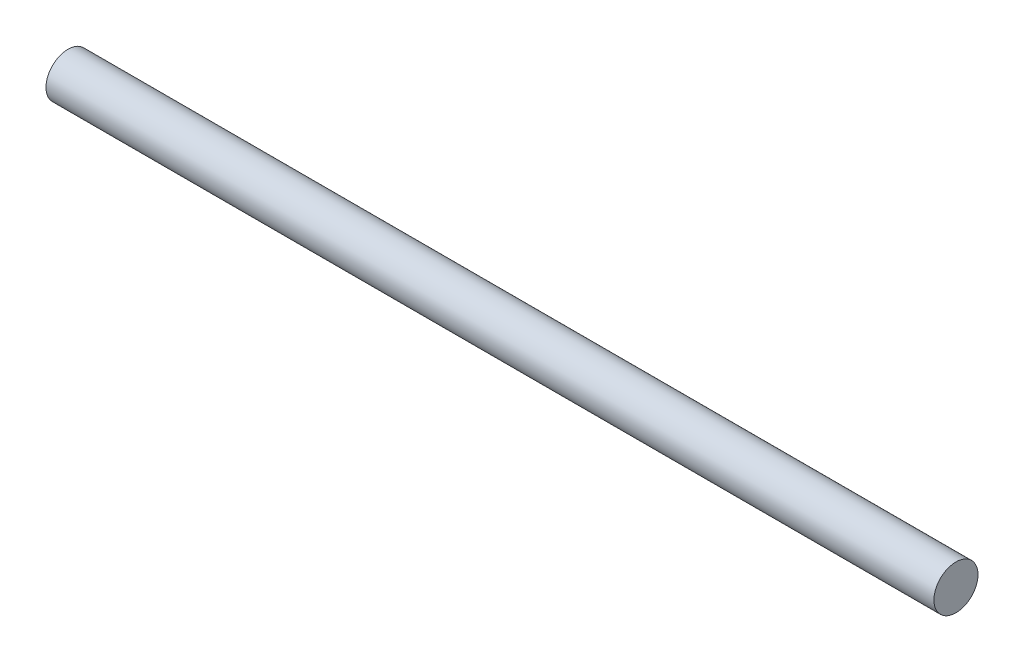
ISO-10303-21;
HEADER;
FILE_DESCRIPTION(('STEP AP214'),'2;1');
FILE_NAME('part.step','',(''),(''),'','','');
FILE_SCHEMA(('AUTOMOTIVE_DESIGN { 1 0 10303 214 1 1 1 1 }'));
ENDSEC;
DATA;
#1=APPLICATION_CONTEXT('core data for automotive mechanical design processes');
#2=APPLICATION_PROTOCOL_DEFINITION('international standard','automotive_design',2000,#1);
#3=PRODUCT_CONTEXT('',#1,'mechanical');
#4=PRODUCT('Part','Part','',(#3));
#5=PRODUCT_RELATED_PRODUCT_CATEGORY('part','',(#4));
#6=PRODUCT_DEFINITION_FORMATION('','',#4);
#7=PRODUCT_DEFINITION_CONTEXT('part definition',#1,'design');
#8=PRODUCT_DEFINITION('design','',#6,#7);
#9=PRODUCT_DEFINITION_SHAPE('','',#8);
#10=(LENGTH_UNIT() NAMED_UNIT(*) SI_UNIT(.MILLI.,.METRE.));
#11=(NAMED_UNIT(*) PLANE_ANGLE_UNIT() SI_UNIT($,.RADIAN.));
#12=(NAMED_UNIT(*) SI_UNIT($,.STERADIAN.) SOLID_ANGLE_UNIT());
#13=UNCERTAINTY_MEASURE_WITH_UNIT(LENGTH_MEASURE(1.E-05),#10,'distance_accuracy_value','');
#14=(GEOMETRIC_REPRESENTATION_CONTEXT(3) GLOBAL_UNCERTAINTY_ASSIGNED_CONTEXT((#13)) GLOBAL_UNIT_ASSIGNED_CONTEXT((#10,
#11,#12)) REPRESENTATION_CONTEXT('',''));
#15=CARTESIAN_POINT('',(0.,0.,0.));
#16=DIRECTION('',(0.,0.,1.));
#17=DIRECTION('',(1.,0.,0.));
#18=AXIS2_PLACEMENT_3D('',#15,#16,#17);
#19=CARTESIAN_POINT('',(141.,0.,0.));
#20=DIRECTION('',(-1.,0.,0.));
#21=DIRECTION('',(0.,0.,1.));
#22=AXIS2_PLACEMENT_3D('',#19,#20,#21);
#23=CYLINDRICAL_SURFACE('',#22,3.5);
#24=CARTESIAN_POINT('',(141.,0.,0.));
#25=DIRECTION('',(1.,0.,0.));
#26=DIRECTION('',(0.,0.,-1.));
#27=AXIS2_PLACEMENT_3D('',#24,#25,#26);
#28=CIRCLE('',#27,3.5);
#29=CARTESIAN_POINT('',(141.,0.,-3.5));
#30=VERTEX_POINT('',#29);
#31=EDGE_CURVE('E10',#30,#30,#28,.T.);
#32=ORIENTED_EDGE('',*,*,#31,.F.);
#33=EDGE_LOOP('',(#32));
#34=FACE_BOUND('',#33,.T.);
#35=CARTESIAN_POINT('',(0.,0.,0.));
#36=DIRECTION('',(1.,0.,0.));
#37=DIRECTION('',(0.,0.,-1.));
#38=AXIS2_PLACEMENT_3D('',#35,#36,#37);
#39=CIRCLE('',#38,3.5);
#40=CARTESIAN_POINT('',(0.,0.,-3.5));
#41=VERTEX_POINT('',#40);
#42=EDGE_CURVE('E34',#41,#41,#39,.T.);
#43=ORIENTED_EDGE('',*,*,#42,.T.);
#44=EDGE_LOOP('',(#43));
#45=FACE_BOUND('',#44,.T.);
#46=ADVANCED_FACE('F31',(#34,#45),#23,.T.);
#47=CARTESIAN_POINT('',(141.,0.,0.));
#48=DIRECTION('',(1.,0.,0.));
#49=DIRECTION('',(0.,0.,-1.));
#50=AXIS2_PLACEMENT_3D('',#47,#48,#49);
#51=PLANE('',#50);
#52=ORIENTED_EDGE('',*,*,#31,.T.);
#53=EDGE_LOOP('',(#52));
#54=FACE_BOUND('',#53,.T.);
#55=ADVANCED_FACE('F46',(#54),#51,.T.);
#56=CARTESIAN_POINT('',(0.,0.,0.));
#57=DIRECTION('',(1.,0.,0.));
#58=DIRECTION('',(0.,0.,-1.));
#59=AXIS2_PLACEMENT_3D('',#56,#57,#58);
#60=PLANE('',#59);
#61=ORIENTED_EDGE('',*,*,#42,.F.);
#62=EDGE_LOOP('',(#61));
#63=FACE_BOUND('',#62,.T.);
#64=ADVANCED_FACE('F44',(#63),#60,.F.);
#65=CLOSED_SHELL('',(#46,#55,#64));
#66=MANIFOLD_SOLID_BREP('B2',#65);
#67=ADVANCED_BREP_SHAPE_REPRESENTATION('',(#18,#66),#14);
#68=SHAPE_DEFINITION_REPRESENTATION(#9,#67);
ENDSEC;
END-ISO-10303-21;
